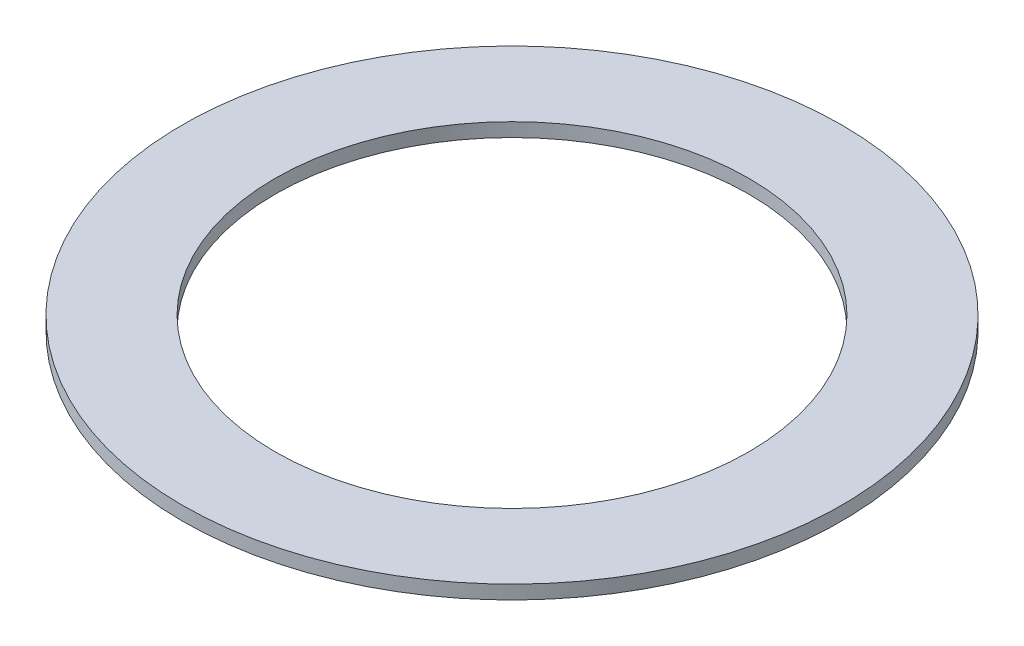
ISO-10303-21;
HEADER;
FILE_DESCRIPTION(('STEP AP214'),'2;1');
FILE_NAME('part.step','',(''),(''),'','','');
FILE_SCHEMA(('AUTOMOTIVE_DESIGN { 1 0 10303 214 1 1 1 1 }'));
ENDSEC;
DATA;
#1=APPLICATION_CONTEXT('core data for automotive mechanical design processes');
#2=APPLICATION_PROTOCOL_DEFINITION('international standard','automotive_design',2000,#1);
#3=PRODUCT_CONTEXT('',#1,'mechanical');
#4=PRODUCT('Part','Part','',(#3));
#5=PRODUCT_RELATED_PRODUCT_CATEGORY('part','',(#4));
#6=PRODUCT_DEFINITION_FORMATION('','',#4);
#7=PRODUCT_DEFINITION_CONTEXT('part definition',#1,'design');
#8=PRODUCT_DEFINITION('design','',#6,#7);
#9=PRODUCT_DEFINITION_SHAPE('','',#8);
#10=(LENGTH_UNIT() NAMED_UNIT(*) SI_UNIT(.MILLI.,.METRE.));
#11=(NAMED_UNIT(*) PLANE_ANGLE_UNIT() SI_UNIT($,.RADIAN.));
#12=(NAMED_UNIT(*) SI_UNIT($,.STERADIAN.) SOLID_ANGLE_UNIT());
#13=UNCERTAINTY_MEASURE_WITH_UNIT(LENGTH_MEASURE(1.E-05),#10,'distance_accuracy_value','');
#14=(GEOMETRIC_REPRESENTATION_CONTEXT(3) GLOBAL_UNCERTAINTY_ASSIGNED_CONTEXT((#13)) GLOBAL_UNIT_ASSIGNED_CONTEXT((#10,
#11,#12)) REPRESENTATION_CONTEXT('',''));
#15=CARTESIAN_POINT('',(0.,0.,0.));
#16=DIRECTION('',(0.,0.,1.));
#17=DIRECTION('',(1.,0.,0.));
#18=AXIS2_PLACEMENT_3D('',#15,#16,#17);
#19=CARTESIAN_POINT('',(0.,0.5,0.));
#20=DIRECTION('',(0.,1.,0.));
#21=DIRECTION('',(0.,0.,1.));
#22=AXIS2_PLACEMENT_3D('',#19,#20,#21);
#23=PLANE('',#22);
#24=CARTESIAN_POINT('',(0.,0.5,0.));
#25=DIRECTION('',(0.,1.,0.));
#26=DIRECTION('',(0.,0.,1.));
#27=AXIS2_PLACEMENT_3D('',#24,#25,#26);
#28=CIRCLE('',#27,12.);
#29=CARTESIAN_POINT('',(0.,0.5,12.));
#30=VERTEX_POINT('',#29);
#31=EDGE_CURVE('E10',#30,#30,#28,.T.);
#32=ORIENTED_EDGE('',*,*,#31,.T.);
#33=EDGE_LOOP('',(#32));
#34=FACE_BOUND('',#33,.T.);
#35=CARTESIAN_POINT('',(0.,0.5,0.));
#36=DIRECTION('',(0.,1.,0.));
#37=DIRECTION('',(0.,0.,1.));
#38=AXIS2_PLACEMENT_3D('',#35,#36,#37);
#39=CIRCLE('',#38,8.625);
#40=CARTESIAN_POINT('',(0.,0.5,8.625));
#41=VERTEX_POINT('',#40);
#42=EDGE_CURVE('E48',#41,#41,#39,.T.);
#43=ORIENTED_EDGE('',*,*,#42,.F.);
#44=EDGE_LOOP('',(#43));
#45=FACE_BOUND('',#44,.T.);
#46=ADVANCED_FACE('F37',(#34,#45),#23,.T.);
#47=CARTESIAN_POINT('',(0.,0.,0.));
#48=DIRECTION('',(0.,1.,0.));
#49=DIRECTION('',(0.,0.,1.));
#50=AXIS2_PLACEMENT_3D('',#47,#48,#49);
#51=PLANE('',#50);
#52=CARTESIAN_POINT('',(0.,0.,0.));
#53=DIRECTION('',(0.,1.,0.));
#54=DIRECTION('',(0.,0.,1.));
#55=AXIS2_PLACEMENT_3D('',#52,#53,#54);
#56=CIRCLE('',#55,12.);
#57=CARTESIAN_POINT('',(0.,0.,12.));
#58=VERTEX_POINT('',#57);
#59=EDGE_CURVE('E41',#58,#58,#56,.T.);
#60=ORIENTED_EDGE('',*,*,#59,.F.);
#61=EDGE_LOOP('',(#60));
#62=FACE_BOUND('',#61,.T.);
#63=CARTESIAN_POINT('',(0.,0.,0.));
#64=DIRECTION('',(0.,1.,0.));
#65=DIRECTION('',(0.,0.,1.));
#66=AXIS2_PLACEMENT_3D('',#63,#64,#65);
#67=CIRCLE('',#66,8.625);
#68=CARTESIAN_POINT('',(0.,0.,8.625));
#69=VERTEX_POINT('',#68);
#70=EDGE_CURVE('E50',#69,#69,#67,.T.);
#71=ORIENTED_EDGE('',*,*,#70,.T.);
#72=EDGE_LOOP('',(#71));
#73=FACE_BOUND('',#72,.T.);
#74=ADVANCED_FACE('F60',(#62,#73),#51,.F.);
#75=CARTESIAN_POINT('',(0.,0.5,0.));
#76=DIRECTION('',(0.,-1.,0.));
#77=DIRECTION('',(0.,0.,-1.));
#78=AXIS2_PLACEMENT_3D('',#75,#76,#77);
#79=CYLINDRICAL_SURFACE('',#78,12.);
#80=ORIENTED_EDGE('',*,*,#31,.F.);
#81=EDGE_LOOP('',(#80));
#82=FACE_BOUND('',#81,.T.);
#83=ORIENTED_EDGE('',*,*,#59,.T.);
#84=EDGE_LOOP('',(#83));
#85=FACE_BOUND('',#84,.T.);
#86=ADVANCED_FACE('F39',(#82,#85),#79,.T.);
#87=CARTESIAN_POINT('',(0.,0.5,0.));
#88=DIRECTION('',(0.,-1.,0.));
#89=DIRECTION('',(0.,0.,-1.));
#90=AXIS2_PLACEMENT_3D('',#87,#88,#89);
#91=CYLINDRICAL_SURFACE('',#90,8.625);
#92=ORIENTED_EDGE('',*,*,#42,.T.);
#93=EDGE_LOOP('',(#92));
#94=FACE_BOUND('',#93,.T.);
#95=ORIENTED_EDGE('',*,*,#70,.F.);
#96=EDGE_LOOP('',(#95));
#97=FACE_BOUND('',#96,.T.);
#98=ADVANCED_FACE('F56',(#94,#97),#91,.F.);
#99=CLOSED_SHELL('',(#46,#74,#86,#98));
#100=MANIFOLD_SOLID_BREP('B2',#99);
#101=ADVANCED_BREP_SHAPE_REPRESENTATION('',(#18,#100),#14);
#102=SHAPE_DEFINITION_REPRESENTATION(#9,#101);
ENDSEC;
END-ISO-10303-21;
